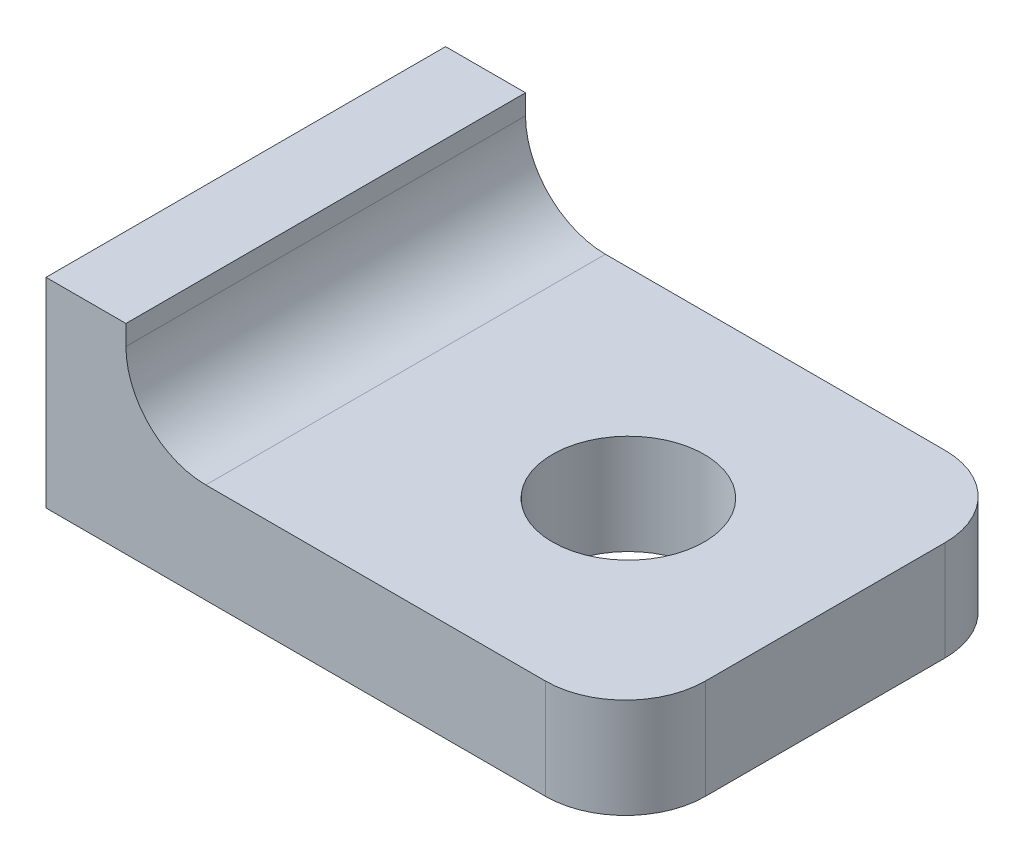
ISO-10303-21;
HEADER;
FILE_DESCRIPTION(('STEP AP214'),'2;1');
FILE_NAME('part.step','',(''),(''),'','','');
FILE_SCHEMA(('AUTOMOTIVE_DESIGN { 1 0 10303 214 1 1 1 1 }'));
ENDSEC;
DATA;
#1=APPLICATION_CONTEXT('core data for automotive mechanical design processes');
#2=APPLICATION_PROTOCOL_DEFINITION('international standard','automotive_design',2000,#1);
#3=PRODUCT_CONTEXT('',#1,'mechanical');
#4=PRODUCT('Part','Part','',(#3));
#5=PRODUCT_RELATED_PRODUCT_CATEGORY('part','',(#4));
#6=PRODUCT_DEFINITION_FORMATION('','',#4);
#7=PRODUCT_DEFINITION_CONTEXT('part definition',#1,'design');
#8=PRODUCT_DEFINITION('design','',#6,#7);
#9=PRODUCT_DEFINITION_SHAPE('','',#8);
#10=(LENGTH_UNIT() NAMED_UNIT(*) SI_UNIT(.MILLI.,.METRE.));
#11=(NAMED_UNIT(*) PLANE_ANGLE_UNIT() SI_UNIT($,.RADIAN.));
#12=(NAMED_UNIT(*) SI_UNIT($,.STERADIAN.) SOLID_ANGLE_UNIT());
#13=UNCERTAINTY_MEASURE_WITH_UNIT(LENGTH_MEASURE(1.E-05),#10,'distance_accuracy_value','');
#14=(GEOMETRIC_REPRESENTATION_CONTEXT(3) GLOBAL_UNCERTAINTY_ASSIGNED_CONTEXT((#13)) GLOBAL_UNIT_ASSIGNED_CONTEXT((#10,
#11,#12)) REPRESENTATION_CONTEXT('',''));
#15=CARTESIAN_POINT('',(0.,0.,0.));
#16=DIRECTION('',(0.,0.,1.));
#17=DIRECTION('',(1.,0.,0.));
#18=AXIS2_PLACEMENT_3D('',#15,#16,#17);
#19=CARTESIAN_POINT('',(7.25,2.5,-5.));
#20=DIRECTION('',(-1.,0.,0.));
#21=DIRECTION('',(0.,0.,1.));
#22=AXIS2_PLACEMENT_3D('',#19,#20,#21);
#23=PLANE('',#22);
#24=DIRECTION('',(0.,0.,-1.));
#25=VECTOR('',#24,1.);
#26=CARTESIAN_POINT('',(7.25,0.,-5.));
#27=LINE('',#26,#25);
#28=CARTESIAN_POINT('',(7.25,0.,3.));
#29=VERTEX_POINT('',#28);
#30=CARTESIAN_POINT('',(7.25,0.,-3.));
#31=VERTEX_POINT('',#30);
#32=EDGE_CURVE('E164',#29,#31,#27,.T.);
#33=ORIENTED_EDGE('',*,*,#32,.T.);
#34=DIRECTION('',(0.,-1.,0.));
#35=VECTOR('',#34,1.);
#36=CARTESIAN_POINT('',(7.25,2.5,-3.));
#37=LINE('',#36,#35);
#38=CARTESIAN_POINT('',(7.25,2.5,-3.));
#39=VERTEX_POINT('',#38);
#40=EDGE_CURVE('E67',#31,#39,#37,.F.);
#41=ORIENTED_EDGE('',*,*,#40,.T.);
#42=DIRECTION('',(0.,0.,-1.));
#43=VECTOR('',#42,1.);
#44=CARTESIAN_POINT('',(7.25,2.5,-5.));
#45=LINE('',#44,#43);
#46=CARTESIAN_POINT('',(7.25,2.5,3.));
#47=VERTEX_POINT('',#46);
#48=EDGE_CURVE('E168',#47,#39,#45,.T.);
#49=ORIENTED_EDGE('',*,*,#48,.F.);
#50=DIRECTION('',(0.,-1.,0.));
#51=VECTOR('',#50,1.);
#52=CARTESIAN_POINT('',(7.25,2.5,3.));
#53=LINE('',#52,#51);
#54=EDGE_CURVE('E212',#47,#29,#53,.T.);
#55=ORIENTED_EDGE('',*,*,#54,.T.);
#56=EDGE_LOOP('',(#33,#41,#49,#55));
#57=FACE_BOUND('',#56,.T.);
#58=ADVANCED_FACE('F45',(#57),#23,.F.);
#59=CARTESIAN_POINT('',(-7.25,2.5,-5.));
#60=DIRECTION('',(0.,0.,1.));
#61=DIRECTION('',(1.,0.,0.));
#62=AXIS2_PLACEMENT_3D('',#59,#60,#61);
#63=PLANE('',#62);
#64=DIRECTION('',(-1.,0.,0.));
#65=VECTOR('',#64,1.);
#66=CARTESIAN_POINT('',(-7.25,2.5,-5.));
#67=LINE('',#66,#65);
#68=CARTESIAN_POINT('',(5.25,2.5,-5.));
#69=VERTEX_POINT('',#68);
#70=CARTESIAN_POINT('',(-3.25,2.5,-5.));
#71=VERTEX_POINT('',#70);
#72=EDGE_CURVE('E171',#69,#71,#67,.T.);
#73=ORIENTED_EDGE('',*,*,#72,.F.);
#74=DIRECTION('',(0.,-1.,0.));
#75=VECTOR('',#74,1.);
#76=CARTESIAN_POINT('',(5.25,2.5,-5.));
#77=LINE('',#76,#75);
#78=CARTESIAN_POINT('',(5.25,0.,-5.));
#79=VERTEX_POINT('',#78);
#80=EDGE_CURVE('E202',#69,#79,#77,.T.);
#81=ORIENTED_EDGE('',*,*,#80,.T.);
#82=DIRECTION('',(-1.,0.,0.));
#83=VECTOR('',#82,1.);
#84=CARTESIAN_POINT('',(-7.25,0.,-5.));
#85=LINE('',#84,#83);
#86=CARTESIAN_POINT('',(-7.25,0.,-5.));
#87=VERTEX_POINT('',#86);
#88=EDGE_CURVE('E179',#79,#87,#85,.T.);
#89=ORIENTED_EDGE('',*,*,#88,.T.);
#90=DIRECTION('',(0.,-1.,0.));
#91=VECTOR('',#90,1.);
#92=CARTESIAN_POINT('',(-7.25,2.5,-5.));
#93=LINE('',#92,#91);
#94=CARTESIAN_POINT('',(-7.25,5.,-5.));
#95=VERTEX_POINT('',#94);
#96=EDGE_CURVE('E129',#95,#87,#93,.T.);
#97=ORIENTED_EDGE('',*,*,#96,.F.);
#98=DIRECTION('',(-1.,0.,0.));
#99=VECTOR('',#98,1.);
#100=CARTESIAN_POINT('',(-7.25,5.,-5.));
#101=LINE('',#100,#99);
#102=CARTESIAN_POINT('',(-5.25,5.,-5.));
#103=VERTEX_POINT('',#102);
#104=EDGE_CURVE('E145',#103,#95,#101,.T.);
#105=ORIENTED_EDGE('',*,*,#104,.F.);
#106=DIRECTION('',(0.,-1.,0.));
#107=VECTOR('',#106,1.);
#108=CARTESIAN_POINT('',(-5.25,5.,-5.));
#109=LINE('',#108,#107);
#110=CARTESIAN_POINT('',(-5.25,4.5,-5.));
#111=VERTEX_POINT('',#110);
#112=EDGE_CURVE('E153',#103,#111,#109,.T.);
#113=ORIENTED_EDGE('',*,*,#112,.T.);
#114=CARTESIAN_POINT('',(-3.25,4.5,-5.));
#115=DIRECTION('',(0.,0.,1.));
#116=DIRECTION('',(1.,0.,0.));
#117=AXIS2_PLACEMENT_3D('',#114,#115,#116);
#118=CIRCLE('',#117,2.);
#119=EDGE_CURVE('E195',#111,#71,#118,.T.);
#120=ORIENTED_EDGE('',*,*,#119,.T.);
#121=EDGE_LOOP('',(#73,#81,#89,#97,#105,#113,#120));
#122=FACE_BOUND('',#121,.T.);
#123=ADVANCED_FACE('F229',(#122),#63,.F.);
#124=CARTESIAN_POINT('',(-7.25,2.5,-5.));
#125=DIRECTION('',(1.,0.,0.));
#126=DIRECTION('',(0.,0.,-1.));
#127=AXIS2_PLACEMENT_3D('',#124,#125,#126);
#128=PLANE('',#127);
#129=DIRECTION('',(0.,0.,1.));
#130=VECTOR('',#129,1.);
#131=CARTESIAN_POINT('',(-7.25,0.,-5.));
#132=LINE('',#131,#130);
#133=CARTESIAN_POINT('',(-7.25,0.,5.));
#134=VERTEX_POINT('',#133);
#135=EDGE_CURVE('E126',#87,#134,#132,.T.);
#136=ORIENTED_EDGE('',*,*,#135,.T.);
#137=DIRECTION('',(0.,-1.,0.));
#138=VECTOR('',#137,1.);
#139=CARTESIAN_POINT('',(-7.25,2.5,5.));
#140=LINE('',#139,#138);
#141=CARTESIAN_POINT('',(-7.25,5.,5.));
#142=VERTEX_POINT('',#141);
#143=EDGE_CURVE('E119',#142,#134,#140,.T.);
#144=ORIENTED_EDGE('',*,*,#143,.F.);
#145=DIRECTION('',(0.,0.,1.));
#146=VECTOR('',#145,1.);
#147=CARTESIAN_POINT('',(-7.25,5.,-5.));
#148=LINE('',#147,#146);
#149=EDGE_CURVE('E124',#95,#142,#148,.T.);
#150=ORIENTED_EDGE('',*,*,#149,.F.);
#151=ORIENTED_EDGE('',*,*,#96,.T.);
#152=EDGE_LOOP('',(#136,#144,#150,#151));
#153=FACE_BOUND('',#152,.T.);
#154=ADVANCED_FACE('F121',(#153),#128,.F.);
#155=CARTESIAN_POINT('',(-7.25,2.5,5.));
#156=DIRECTION('',(0.,0.,-1.));
#157=DIRECTION('',(-1.,0.,0.));
#158=AXIS2_PLACEMENT_3D('',#155,#156,#157);
#159=PLANE('',#158);
#160=DIRECTION('',(1.,0.,0.));
#161=VECTOR('',#160,1.);
#162=CARTESIAN_POINT('',(-7.25,0.,5.));
#163=LINE('',#162,#161);
#164=CARTESIAN_POINT('',(5.25,0.,5.));
#165=VERTEX_POINT('',#164);
#166=EDGE_CURVE('E172',#134,#165,#163,.T.);
#167=ORIENTED_EDGE('',*,*,#166,.T.);
#168=DIRECTION('',(0.,-1.,0.));
#169=VECTOR('',#168,1.);
#170=CARTESIAN_POINT('',(5.25,2.5,5.));
#171=LINE('',#170,#169);
#172=CARTESIAN_POINT('',(5.25,2.5,5.));
#173=VERTEX_POINT('',#172);
#174=EDGE_CURVE('E11',#165,#173,#171,.F.);
#175=ORIENTED_EDGE('',*,*,#174,.T.);
#176=DIRECTION('',(1.,0.,0.));
#177=VECTOR('',#176,1.);
#178=CARTESIAN_POINT('',(-7.25,2.5,5.));
#179=LINE('',#178,#177);
#180=CARTESIAN_POINT('',(-3.25,2.5,5.));
#181=VERTEX_POINT('',#180);
#182=EDGE_CURVE('E130',#181,#173,#179,.T.);
#183=ORIENTED_EDGE('',*,*,#182,.F.);
#184=CARTESIAN_POINT('',(-3.25,4.5,5.));
#185=DIRECTION('',(0.,0.,-1.));
#186=DIRECTION('',(-1.,0.,0.));
#187=AXIS2_PLACEMENT_3D('',#184,#185,#186);
#188=CIRCLE('',#187,2.);
#189=CARTESIAN_POINT('',(-5.25,4.5,5.));
#190=VERTEX_POINT('',#189);
#191=EDGE_CURVE('E199',#181,#190,#188,.T.);
#192=ORIENTED_EDGE('',*,*,#191,.T.);
#193=DIRECTION('',(0.,-1.,0.));
#194=VECTOR('',#193,1.);
#195=CARTESIAN_POINT('',(-5.25,5.,5.));
#196=LINE('',#195,#194);
#197=CARTESIAN_POINT('',(-5.25,5.,5.));
#198=VERTEX_POINT('',#197);
#199=EDGE_CURVE('E136',#198,#190,#196,.T.);
#200=ORIENTED_EDGE('',*,*,#199,.F.);
#201=DIRECTION('',(1.,0.,0.));
#202=VECTOR('',#201,1.);
#203=CARTESIAN_POINT('',(-7.25,5.,5.));
#204=LINE('',#203,#202);
#205=EDGE_CURVE('E133',#142,#198,#204,.T.);
#206=ORIENTED_EDGE('',*,*,#205,.F.);
#207=ORIENTED_EDGE('',*,*,#143,.T.);
#208=EDGE_LOOP('',(#167,#175,#183,#192,#200,#206,#207));
#209=FACE_BOUND('',#208,.T.);
#210=ADVANCED_FACE('F134',(#209),#159,.F.);
#211=CARTESIAN_POINT('',(0.,2.5,0.));
#212=DIRECTION('',(0.,1.,0.));
#213=DIRECTION('',(0.,0.,1.));
#214=AXIS2_PLACEMENT_3D('',#211,#212,#213);
#215=PLANE('',#214);
#216=ORIENTED_EDGE('',*,*,#48,.T.);
#217=CARTESIAN_POINT('',(5.25,2.5,-3.));
#218=DIRECTION('',(0.,1.,0.));
#219=DIRECTION('',(0.,0.,1.));
#220=AXIS2_PLACEMENT_3D('',#217,#218,#219);
#221=CIRCLE('',#220,2.);
#222=EDGE_CURVE('E54',#39,#69,#221,.T.);
#223=ORIENTED_EDGE('',*,*,#222,.T.);
#224=ORIENTED_EDGE('',*,*,#72,.T.);
#225=DIRECTION('',(0.,0.,-1.));
#226=VECTOR('',#225,1.);
#227=CARTESIAN_POINT('',(-3.25,2.5,0.));
#228=LINE('',#227,#226);
#229=EDGE_CURVE('E192',#71,#181,#228,.F.);
#230=ORIENTED_EDGE('',*,*,#229,.T.);
#231=ORIENTED_EDGE('',*,*,#182,.T.);
#232=CARTESIAN_POINT('',(5.25,2.5,3.));
#233=DIRECTION('',(0.,1.,0.));
#234=DIRECTION('',(0.,0.,1.));
#235=AXIS2_PLACEMENT_3D('',#232,#233,#234);
#236=CIRCLE('',#235,2.);
#237=EDGE_CURVE('E218',#173,#47,#236,.T.);
#238=ORIENTED_EDGE('',*,*,#237,.T.);
#239=EDGE_LOOP('',(#216,#223,#224,#230,#231,#238));
#240=FACE_BOUND('',#239,.T.);
#241=CARTESIAN_POINT('',(2.32345592057822,2.5,0.));
#242=DIRECTION('',(0.,1.,0.));
#243=DIRECTION('',(0.,0.,1.));
#244=AXIS2_PLACEMENT_3D('',#241,#242,#243);
#245=CIRCLE('',#244,1.9);
#246=CARTESIAN_POINT('',(2.32345592057822,2.5,1.9));
#247=VERTEX_POINT('',#246);
#248=EDGE_CURVE('E159',#247,#247,#245,.T.);
#249=ORIENTED_EDGE('',*,*,#248,.F.);
#250=EDGE_LOOP('',(#249));
#251=FACE_BOUND('',#250,.T.);
#252=ADVANCED_FACE('F224',(#240,#251),#215,.T.);
#253=CARTESIAN_POINT('',(0.,0.,0.));
#254=DIRECTION('',(0.,1.,0.));
#255=DIRECTION('',(0.,0.,1.));
#256=AXIS2_PLACEMENT_3D('',#253,#254,#255);
#257=PLANE('',#256);
#258=CARTESIAN_POINT('',(2.32345592057822,0.,0.));
#259=DIRECTION('',(0.,1.,0.));
#260=DIRECTION('',(0.,0.,1.));
#261=AXIS2_PLACEMENT_3D('',#258,#259,#260);
#262=CIRCLE('',#261,1.9);
#263=CARTESIAN_POINT('',(2.32345592057822,0.,1.9));
#264=VERTEX_POINT('',#263);
#265=EDGE_CURVE('E160',#264,#264,#262,.T.);
#266=ORIENTED_EDGE('',*,*,#265,.T.);
#267=EDGE_LOOP('',(#266));
#268=FACE_BOUND('',#267,.T.);
#269=ORIENTED_EDGE('',*,*,#88,.F.);
#270=CARTESIAN_POINT('',(5.25,0.,-3.));
#271=DIRECTION('',(0.,1.,0.));
#272=DIRECTION('',(0.,0.,1.));
#273=AXIS2_PLACEMENT_3D('',#270,#271,#272);
#274=CIRCLE('',#273,2.);
#275=EDGE_CURVE('E209',#79,#31,#274,.F.);
#276=ORIENTED_EDGE('',*,*,#275,.T.);
#277=ORIENTED_EDGE('',*,*,#32,.F.);
#278=CARTESIAN_POINT('',(5.25,0.,3.));
#279=DIRECTION('',(0.,1.,0.));
#280=DIRECTION('',(0.,0.,1.));
#281=AXIS2_PLACEMENT_3D('',#278,#279,#280);
#282=CIRCLE('',#281,2.);
#283=EDGE_CURVE('E206',#29,#165,#282,.F.);
#284=ORIENTED_EDGE('',*,*,#283,.T.);
#285=ORIENTED_EDGE('',*,*,#166,.F.);
#286=ORIENTED_EDGE('',*,*,#135,.F.);
#287=EDGE_LOOP('',(#269,#276,#277,#284,#285,#286));
#288=FACE_BOUND('',#287,.T.);
#289=ADVANCED_FACE('F235',(#268,#288),#257,.F.);
#290=CARTESIAN_POINT('',(2.32345592057822,0.,0.));
#291=DIRECTION('',(0.,1.,0.));
#292=DIRECTION('',(0.,0.,1.));
#293=AXIS2_PLACEMENT_3D('',#290,#291,#292);
#294=CYLINDRICAL_SURFACE('',#293,1.9);
#295=ORIENTED_EDGE('',*,*,#265,.F.);
#296=EDGE_LOOP('',(#295));
#297=FACE_BOUND('',#296,.T.);
#298=ORIENTED_EDGE('',*,*,#248,.T.);
#299=EDGE_LOOP('',(#298));
#300=FACE_BOUND('',#299,.T.);
#301=ADVANCED_FACE('F247',(#297,#300),#294,.F.);
#302=CARTESIAN_POINT('',(-5.25,5.,-5.));
#303=DIRECTION('',(-1.,0.,0.));
#304=DIRECTION('',(0.,0.,1.));
#305=AXIS2_PLACEMENT_3D('',#302,#303,#304);
#306=PLANE('',#305);
#307=ORIENTED_EDGE('',*,*,#199,.T.);
#308=DIRECTION('',(0.,0.,-1.));
#309=VECTOR('',#308,1.);
#310=CARTESIAN_POINT('',(-5.25,4.5,-5.));
#311=LINE('',#310,#309);
#312=EDGE_CURVE('E188',#190,#111,#311,.T.);
#313=ORIENTED_EDGE('',*,*,#312,.T.);
#314=ORIENTED_EDGE('',*,*,#112,.F.);
#315=DIRECTION('',(0.,0.,-1.));
#316=VECTOR('',#315,1.);
#317=CARTESIAN_POINT('',(-5.25,5.,-5.));
#318=LINE('',#317,#316);
#319=EDGE_CURVE('E140',#198,#103,#318,.T.);
#320=ORIENTED_EDGE('',*,*,#319,.F.);
#321=EDGE_LOOP('',(#307,#313,#314,#320));
#322=FACE_BOUND('',#321,.T.);
#323=ADVANCED_FACE('F245',(#322),#306,.F.);
#324=CARTESIAN_POINT('',(0.,5.,0.));
#325=DIRECTION('',(0.,1.,0.));
#326=DIRECTION('',(0.,0.,1.));
#327=AXIS2_PLACEMENT_3D('',#324,#325,#326);
#328=PLANE('',#327);
#329=ORIENTED_EDGE('',*,*,#149,.T.);
#330=ORIENTED_EDGE('',*,*,#205,.T.);
#331=ORIENTED_EDGE('',*,*,#319,.T.);
#332=ORIENTED_EDGE('',*,*,#104,.T.);
#333=EDGE_LOOP('',(#329,#330,#331,#332));
#334=FACE_BOUND('',#333,.T.);
#335=ADVANCED_FACE('F143',(#334),#328,.T.);
#336=CARTESIAN_POINT('',(-3.25,4.5,-5.));
#337=DIRECTION('',(0.,0.,-1.));
#338=DIRECTION('',(-1.,0.,0.));
#339=AXIS2_PLACEMENT_3D('',#336,#337,#338);
#340=CYLINDRICAL_SURFACE('',#339,2.);
#341=ORIENTED_EDGE('',*,*,#191,.F.);
#342=ORIENTED_EDGE('',*,*,#229,.F.);
#343=ORIENTED_EDGE('',*,*,#119,.F.);
#344=ORIENTED_EDGE('',*,*,#312,.F.);
#345=EDGE_LOOP('',(#341,#342,#343,#344));
#346=FACE_BOUND('',#345,.T.);
#347=ADVANCED_FACE('F242',(#346),#340,.F.);
#348=CARTESIAN_POINT('',(5.25,2.5,-3.));
#349=DIRECTION('',(0.,-1.,0.));
#350=DIRECTION('',(0.,0.,-1.));
#351=AXIS2_PLACEMENT_3D('',#348,#349,#350);
#352=CYLINDRICAL_SURFACE('',#351,2.);
#353=ORIENTED_EDGE('',*,*,#222,.F.);
#354=ORIENTED_EDGE('',*,*,#40,.F.);
#355=ORIENTED_EDGE('',*,*,#275,.F.);
#356=ORIENTED_EDGE('',*,*,#80,.F.);
#357=EDGE_LOOP('',(#353,#354,#355,#356));
#358=FACE_BOUND('',#357,.T.);
#359=ADVANCED_FACE('F232',(#358),#352,.T.);
#360=CARTESIAN_POINT('',(5.25,2.5,3.));
#361=DIRECTION('',(0.,-1.,0.));
#362=DIRECTION('',(0.,0.,-1.));
#363=AXIS2_PLACEMENT_3D('',#360,#361,#362);
#364=CYLINDRICAL_SURFACE('',#363,2.);
#365=ORIENTED_EDGE('',*,*,#237,.F.);
#366=ORIENTED_EDGE('',*,*,#174,.F.);
#367=ORIENTED_EDGE('',*,*,#283,.F.);
#368=ORIENTED_EDGE('',*,*,#54,.F.);
#369=EDGE_LOOP('',(#365,#366,#367,#368));
#370=FACE_BOUND('',#369,.T.);
#371=ADVANCED_FACE('F47',(#370),#364,.T.);
#372=CLOSED_SHELL('',(#58,#123,#154,#210,#252,#289,#301,#323,#335,#347,#359,#371));
#373=MANIFOLD_SOLID_BREP('B2',#372);
#374=ADVANCED_BREP_SHAPE_REPRESENTATION('',(#18,#373),#14);
#375=SHAPE_DEFINITION_REPRESENTATION(#9,#374);
ENDSEC;
END-ISO-10303-21;
